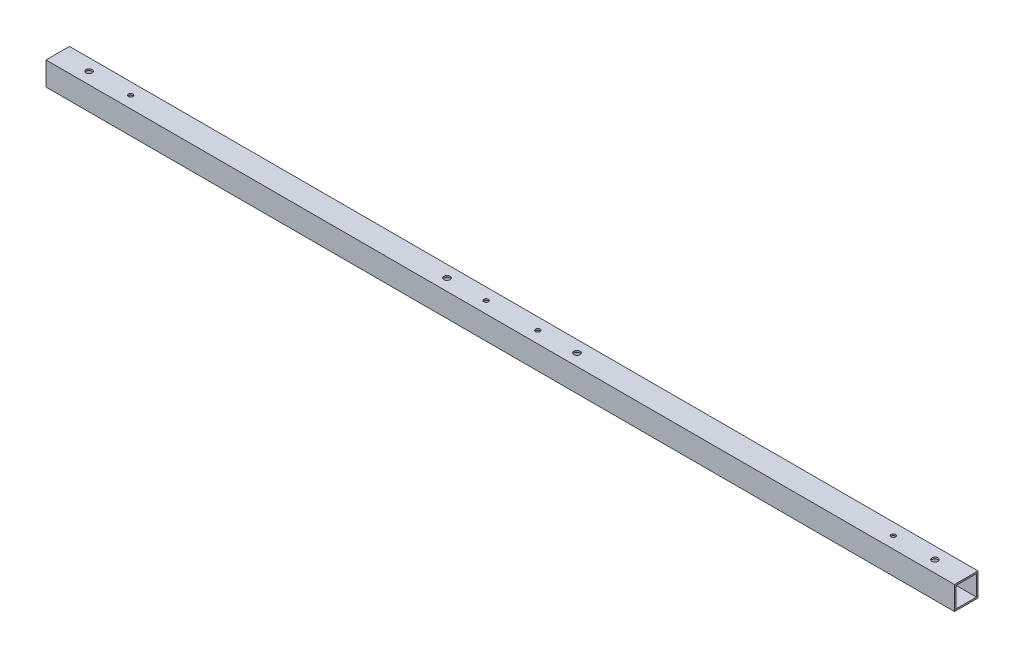
ISO-10303-21;
HEADER;
FILE_DESCRIPTION(('STEP AP214'),'2;1');
FILE_NAME('part.step','',(''),(''),'','','');
FILE_SCHEMA(('AUTOMOTIVE_DESIGN { 1 0 10303 214 1 1 1 1 }'));
ENDSEC;
DATA;
#1=APPLICATION_CONTEXT('core data for automotive mechanical design processes');
#2=APPLICATION_PROTOCOL_DEFINITION('international standard','automotive_design',2000,#1);
#3=PRODUCT_CONTEXT('',#1,'mechanical');
#4=PRODUCT('Part','Part','',(#3));
#5=PRODUCT_RELATED_PRODUCT_CATEGORY('part','',(#4));
#6=PRODUCT_DEFINITION_FORMATION('','',#4);
#7=PRODUCT_DEFINITION_CONTEXT('part definition',#1,'design');
#8=PRODUCT_DEFINITION('design','',#6,#7);
#9=PRODUCT_DEFINITION_SHAPE('','',#8);
#10=(LENGTH_UNIT() NAMED_UNIT(*) SI_UNIT(.MILLI.,.METRE.));
#11=(NAMED_UNIT(*) PLANE_ANGLE_UNIT() SI_UNIT($,.RADIAN.));
#12=(NAMED_UNIT(*) SI_UNIT($,.STERADIAN.) SOLID_ANGLE_UNIT());
#13=UNCERTAINTY_MEASURE_WITH_UNIT(LENGTH_MEASURE(1.E-05),#10,'distance_accuracy_value','');
#14=(GEOMETRIC_REPRESENTATION_CONTEXT(3) GLOBAL_UNCERTAINTY_ASSIGNED_CONTEXT((#13)) GLOBAL_UNIT_ASSIGNED_CONTEXT((#10,
#11,#12)) REPRESENTATION_CONTEXT('',''));
#15=CARTESIAN_POINT('',(0.,0.,0.));
#16=DIRECTION('',(0.,0.,1.));
#17=DIRECTION('',(1.,0.,0.));
#18=AXIS2_PLACEMENT_3D('',#15,#16,#17);
#19=CARTESIAN_POINT('',(320.,-6.50000000000001,-6.49999999999999));
#20=DIRECTION('',(0.,0.,1.));
#21=DIRECTION('',(1.,0.,0.));
#22=AXIS2_PLACEMENT_3D('',#19,#20,#21);
#23=PLANE('',#22);
#24=DIRECTION('',(0.,1.,0.));
#25=VECTOR('',#24,1.);
#26=CARTESIAN_POINT('',(-290.,-6.50000000000001,-6.49999999999999));
#27=LINE('',#26,#25);
#28=CARTESIAN_POINT('',(-290.,-6.50000000000001,-6.49999999999999));
#29=VERTEX_POINT('',#28);
#30=CARTESIAN_POINT('',(-290.,6.49999999999999,-6.49999999999999));
#31=VERTEX_POINT('',#30);
#32=EDGE_CURVE('E134',#29,#31,#27,.T.);
#33=ORIENTED_EDGE('',*,*,#32,.F.);
#34=DIRECTION('',(-1.,0.,0.));
#35=VECTOR('',#34,1.);
#36=CARTESIAN_POINT('',(320.,-6.50000000000001,-6.49999999999999));
#37=LINE('',#36,#35);
#38=CARTESIAN_POINT('',(290.,-6.50000000000001,-6.49999999999999));
#39=VERTEX_POINT('',#38);
#40=EDGE_CURVE('E202',#39,#29,#37,.T.);
#41=ORIENTED_EDGE('',*,*,#40,.F.);
#42=DIRECTION('',(0.,-1.,0.));
#43=VECTOR('',#42,1.);
#44=CARTESIAN_POINT('',(290.,-6.50000000000001,-6.49999999999999));
#45=LINE('',#44,#43);
#46=CARTESIAN_POINT('',(290.,6.49999999999999,-6.49999999999999));
#47=VERTEX_POINT('',#46);
#48=EDGE_CURVE('E376',#47,#39,#45,.T.);
#49=ORIENTED_EDGE('',*,*,#48,.F.);
#50=DIRECTION('',(-1.,0.,0.));
#51=VECTOR('',#50,1.);
#52=CARTESIAN_POINT('',(320.,6.49999999999999,-6.49999999999999));
#53=LINE('',#52,#51);
#54=EDGE_CURVE('E153',#47,#31,#53,.T.);
#55=ORIENTED_EDGE('',*,*,#54,.T.);
#56=EDGE_LOOP('',(#33,#41,#49,#55));
#57=FACE_BOUND('',#56,.T.);
#58=ADVANCED_FACE('F61',(#57),#23,.T.);
#59=CARTESIAN_POINT('',(320.,-6.50000000000001,6.50000000000001));
#60=DIRECTION('',(0.,1.,0.));
#61=DIRECTION('',(0.,0.,1.));
#62=AXIS2_PLACEMENT_3D('',#59,#60,#61);
#63=PLANE('',#62);
#64=DIRECTION('',(0.,0.,-1.));
#65=VECTOR('',#64,1.);
#66=CARTESIAN_POINT('',(-290.,-6.50000000000001,6.50000000000001));
#67=LINE('',#66,#65);
#68=CARTESIAN_POINT('',(-290.,-6.50000000000001,6.50000000000001));
#69=VERTEX_POINT('',#68);
#70=EDGE_CURVE('E251',#69,#29,#67,.T.);
#71=ORIENTED_EDGE('',*,*,#70,.F.);
#72=DIRECTION('',(-1.,0.,0.));
#73=VECTOR('',#72,1.);
#74=CARTESIAN_POINT('',(320.,-6.50000000000001,6.50000000000001));
#75=LINE('',#74,#73);
#76=CARTESIAN_POINT('',(290.,-6.50000000000001,6.50000000000001));
#77=VERTEX_POINT('',#76);
#78=EDGE_CURVE('E208',#77,#69,#75,.T.);
#79=ORIENTED_EDGE('',*,*,#78,.F.);
#80=DIRECTION('',(0.,0.,1.));
#81=VECTOR('',#80,1.);
#82=CARTESIAN_POINT('',(290.,-6.50000000000001,6.50000000000001));
#83=LINE('',#82,#81);
#84=EDGE_CURVE('E373',#39,#77,#83,.T.);
#85=ORIENTED_EDGE('',*,*,#84,.F.);
#86=ORIENTED_EDGE('',*,*,#40,.T.);
#87=EDGE_LOOP('',(#71,#79,#85,#86));
#88=FACE_BOUND('',#87,.T.);
#89=CARTESIAN_POINT('',(-16.5,-6.50000000000001,0.));
#90=DIRECTION('',(0.,1.,0.));
#91=DIRECTION('',(0.,0.,1.));
#92=AXIS2_PLACEMENT_3D('',#89,#90,#91);
#93=CIRCLE('',#92,1.45);
#94=CARTESIAN_POINT('',(-16.5,-6.50000000000001,1.45));
#95=VERTEX_POINT('',#94);
#96=EDGE_CURVE('E200',#95,#95,#93,.T.);
#97=ORIENTED_EDGE('',*,*,#96,.F.);
#98=EDGE_LOOP('',(#97));
#99=FACE_BOUND('',#98,.T.);
#100=CARTESIAN_POINT('',(16.5,-6.50000000000001,0.));
#101=DIRECTION('',(0.,1.,0.));
#102=DIRECTION('',(0.,0.,1.));
#103=AXIS2_PLACEMENT_3D('',#100,#101,#102);
#104=CIRCLE('',#103,1.45);
#105=CARTESIAN_POINT('',(16.5,-6.50000000000001,1.45));
#106=VERTEX_POINT('',#105);
#107=EDGE_CURVE('E195',#106,#106,#104,.T.);
#108=ORIENTED_EDGE('',*,*,#107,.F.);
#109=EDGE_LOOP('',(#108));
#110=FACE_BOUND('',#109,.T.);
#111=CARTESIAN_POINT('',(-243.5,-6.50000000000001,0.));
#112=DIRECTION('',(0.,1.,0.));
#113=DIRECTION('',(0.,0.,1.));
#114=AXIS2_PLACEMENT_3D('',#111,#112,#113);
#115=CIRCLE('',#114,1.45);
#116=CARTESIAN_POINT('',(-243.5,-6.50000000000001,1.45));
#117=VERTEX_POINT('',#116);
#118=EDGE_CURVE('E190',#117,#117,#115,.T.);
#119=ORIENTED_EDGE('',*,*,#118,.F.);
#120=EDGE_LOOP('',(#119));
#121=FACE_BOUND('',#120,.T.);
#122=CARTESIAN_POINT('',(243.5,-6.50000000000001,0.));
#123=DIRECTION('',(0.,1.,0.));
#124=DIRECTION('',(0.,0.,1.));
#125=AXIS2_PLACEMENT_3D('',#122,#123,#124);
#126=CIRCLE('',#125,1.45);
#127=CARTESIAN_POINT('',(243.5,-6.50000000000001,1.44999999999994));
#128=VERTEX_POINT('',#127);
#129=EDGE_CURVE('E184',#128,#128,#126,.T.);
#130=ORIENTED_EDGE('',*,*,#129,.F.);
#131=EDGE_LOOP('',(#130));
#132=FACE_BOUND('',#131,.T.);
#133=CARTESIAN_POINT('',(-270.,-6.50000000000001,0.));
#134=DIRECTION('',(0.,1.,0.));
#135=DIRECTION('',(0.,0.,1.));
#136=AXIS2_PLACEMENT_3D('',#133,#134,#135);
#137=CIRCLE('',#136,1.95000000000003);
#138=CARTESIAN_POINT('',(-270.,-6.50000000000001,1.95000000000003));
#139=VERTEX_POINT('',#138);
#140=EDGE_CURVE('E179',#139,#139,#137,.T.);
#141=ORIENTED_EDGE('',*,*,#140,.F.);
#142=EDGE_LOOP('',(#141));
#143=FACE_BOUND('',#142,.T.);
#144=CARTESIAN_POINT('',(270.,-6.50000000000001,0.));
#145=DIRECTION('',(0.,1.,0.));
#146=DIRECTION('',(0.,0.,1.));
#147=AXIS2_PLACEMENT_3D('',#144,#145,#146);
#148=CIRCLE('',#147,1.95000000000003);
#149=CARTESIAN_POINT('',(270.,-6.50000000000001,1.94999999999996));
#150=VERTEX_POINT('',#149);
#151=EDGE_CURVE('E174',#150,#150,#148,.T.);
#152=ORIENTED_EDGE('',*,*,#151,.F.);
#153=EDGE_LOOP('',(#152));
#154=FACE_BOUND('',#153,.T.);
#155=CARTESIAN_POINT('',(41.5,-6.50000000000001,0.));
#156=DIRECTION('',(0.,1.,0.));
#157=DIRECTION('',(0.,0.,1.));
#158=AXIS2_PLACEMENT_3D('',#155,#156,#157);
#159=CIRCLE('',#158,1.95);
#160=CARTESIAN_POINT('',(41.5,-6.50000000000001,1.94999999999999));
#161=VERTEX_POINT('',#160);
#162=EDGE_CURVE('E169',#161,#161,#159,.T.);
#163=ORIENTED_EDGE('',*,*,#162,.F.);
#164=EDGE_LOOP('',(#163));
#165=FACE_BOUND('',#164,.T.);
#166=CARTESIAN_POINT('',(-41.5,-6.50000000000001,0.));
#167=DIRECTION('',(0.,1.,0.));
#168=DIRECTION('',(0.,0.,1.));
#169=AXIS2_PLACEMENT_3D('',#166,#167,#168);
#170=CIRCLE('',#169,1.95);
#171=CARTESIAN_POINT('',(-41.5,-6.50000000000001,1.95));
#172=VERTEX_POINT('',#171);
#173=EDGE_CURVE('E163',#172,#172,#170,.T.);
#174=ORIENTED_EDGE('',*,*,#173,.F.);
#175=EDGE_LOOP('',(#174));
#176=FACE_BOUND('',#175,.T.);
#177=ADVANCED_FACE('F346',(#88,#99,#110,#121,#132,#143,#154,#165,#176),#63,.T.);
#178=CARTESIAN_POINT('',(320.,-6.50000000000001,6.50000000000001));
#179=DIRECTION('',(0.,0.,-1.));
#180=DIRECTION('',(-1.,0.,0.));
#181=AXIS2_PLACEMENT_3D('',#178,#179,#180);
#182=PLANE('',#181);
#183=DIRECTION('',(0.,-1.,0.));
#184=VECTOR('',#183,1.);
#185=CARTESIAN_POINT('',(-290.,-6.50000000000001,6.50000000000001));
#186=LINE('',#185,#184);
#187=CARTESIAN_POINT('',(-290.,6.49999999999999,6.50000000000001));
#188=VERTEX_POINT('',#187);
#189=EDGE_CURVE('E248',#188,#69,#186,.T.);
#190=ORIENTED_EDGE('',*,*,#189,.F.);
#191=DIRECTION('',(-1.,0.,0.));
#192=VECTOR('',#191,1.);
#193=CARTESIAN_POINT('',(320.,6.49999999999999,6.50000000000001));
#194=LINE('',#193,#192);
#195=CARTESIAN_POINT('',(290.,6.49999999999999,6.50000000000001));
#196=VERTEX_POINT('',#195);
#197=EDGE_CURVE('E216',#196,#188,#194,.T.);
#198=ORIENTED_EDGE('',*,*,#197,.F.);
#199=DIRECTION('',(0.,1.,0.));
#200=VECTOR('',#199,1.);
#201=CARTESIAN_POINT('',(290.,-6.50000000000001,6.50000000000001));
#202=LINE('',#201,#200);
#203=EDGE_CURVE('E246',#77,#196,#202,.T.);
#204=ORIENTED_EDGE('',*,*,#203,.F.);
#205=ORIENTED_EDGE('',*,*,#78,.T.);
#206=EDGE_LOOP('',(#190,#198,#204,#205));
#207=FACE_BOUND('',#206,.T.);
#208=ADVANCED_FACE('F245',(#207),#182,.T.);
#209=CARTESIAN_POINT('',(320.,-7.50000000000001,-7.49999999999999));
#210=DIRECTION('',(0.,0.,1.));
#211=DIRECTION('',(1.,0.,0.));
#212=AXIS2_PLACEMENT_3D('',#209,#210,#211);
#213=PLANE('',#212);
#214=DIRECTION('',(-1.,0.,0.));
#215=VECTOR('',#214,1.);
#216=CARTESIAN_POINT('',(320.,-7.50000000000001,-7.49999999999999));
#217=LINE('',#216,#215);
#218=CARTESIAN_POINT('',(290.,-7.50000000000001,-7.49999999999999));
#219=VERTEX_POINT('',#218);
#220=CARTESIAN_POINT('',(-290.,-7.50000000000001,-7.49999999999999));
#221=VERTEX_POINT('',#220);
#222=EDGE_CURVE('E155',#219,#221,#217,.T.);
#223=ORIENTED_EDGE('',*,*,#222,.T.);
#224=DIRECTION('',(0.,1.,0.));
#225=VECTOR('',#224,1.);
#226=CARTESIAN_POINT('',(-290.,-7.50000000000001,-7.49999999999999));
#227=LINE('',#226,#225);
#228=CARTESIAN_POINT('',(-290.,7.49999999999999,-7.49999999999999));
#229=VERTEX_POINT('',#228);
#230=EDGE_CURVE('E85',#221,#229,#227,.T.);
#231=ORIENTED_EDGE('',*,*,#230,.T.);
#232=DIRECTION('',(-1.,0.,0.));
#233=VECTOR('',#232,1.);
#234=CARTESIAN_POINT('',(320.,7.49999999999999,-7.49999999999999));
#235=LINE('',#234,#233);
#236=CARTESIAN_POINT('',(290.,7.49999999999999,-7.49999999999999));
#237=VERTEX_POINT('',#236);
#238=EDGE_CURVE('E143',#237,#229,#235,.T.);
#239=ORIENTED_EDGE('',*,*,#238,.F.);
#240=DIRECTION('',(0.,-1.,0.));
#241=VECTOR('',#240,1.);
#242=CARTESIAN_POINT('',(290.,-7.50000000000001,-7.49999999999999));
#243=LINE('',#242,#241);
#244=EDGE_CURVE('E252',#237,#219,#243,.T.);
#245=ORIENTED_EDGE('',*,*,#244,.T.);
#246=EDGE_LOOP('',(#223,#231,#239,#245));
#247=FACE_BOUND('',#246,.T.);
#248=ADVANCED_FACE('F63',(#247),#213,.F.);
#249=CARTESIAN_POINT('',(320.,7.49999999999999,7.50000000000001));
#250=DIRECTION('',(0.,-1.,0.));
#251=DIRECTION('',(0.,0.,-1.));
#252=AXIS2_PLACEMENT_3D('',#249,#250,#251);
#253=PLANE('',#252);
#254=CARTESIAN_POINT('',(-16.5,7.49999999999999,0.));
#255=DIRECTION('',(0.,1.,0.));
#256=DIRECTION('',(0.,0.,1.));
#257=AXIS2_PLACEMENT_3D('',#254,#255,#256);
#258=CIRCLE('',#257,1.45);
#259=CARTESIAN_POINT('',(-16.5,7.49999999999999,1.45));
#260=VERTEX_POINT('',#259);
#261=EDGE_CURVE('E268',#260,#260,#258,.T.);
#262=ORIENTED_EDGE('',*,*,#261,.F.);
#263=EDGE_LOOP('',(#262));
#264=FACE_BOUND('',#263,.T.);
#265=CARTESIAN_POINT('',(16.5,7.49999999999999,0.));
#266=DIRECTION('',(0.,1.,0.));
#267=DIRECTION('',(0.,0.,1.));
#268=AXIS2_PLACEMENT_3D('',#265,#266,#267);
#269=CIRCLE('',#268,1.45);
#270=CARTESIAN_POINT('',(16.5,7.49999999999999,1.45));
#271=VERTEX_POINT('',#270);
#272=EDGE_CURVE('E272',#271,#271,#269,.T.);
#273=ORIENTED_EDGE('',*,*,#272,.F.);
#274=EDGE_LOOP('',(#273));
#275=FACE_BOUND('',#274,.T.);
#276=CARTESIAN_POINT('',(-243.5,7.49999999999999,0.));
#277=DIRECTION('',(0.,1.,0.));
#278=DIRECTION('',(0.,0.,1.));
#279=AXIS2_PLACEMENT_3D('',#276,#277,#278);
#280=CIRCLE('',#279,1.45);
#281=CARTESIAN_POINT('',(-243.5,7.49999999999999,1.45));
#282=VERTEX_POINT('',#281);
#283=EDGE_CURVE('E289',#282,#282,#280,.T.);
#284=ORIENTED_EDGE('',*,*,#283,.F.);
#285=EDGE_LOOP('',(#284));
#286=FACE_BOUND('',#285,.T.);
#287=CARTESIAN_POINT('',(243.5,7.49999999999999,0.));
#288=DIRECTION('',(0.,1.,0.));
#289=DIRECTION('',(0.,0.,-1.));
#290=AXIS2_PLACEMENT_3D('',#287,#288,#289);
#291=CIRCLE('',#290,1.45);
#292=CARTESIAN_POINT('',(243.5,7.49999999999999,-1.45000000000006));
#293=VERTEX_POINT('',#292);
#294=EDGE_CURVE('E293',#293,#293,#291,.T.);
#295=ORIENTED_EDGE('',*,*,#294,.F.);
#296=EDGE_LOOP('',(#295));
#297=FACE_BOUND('',#296,.T.);
#298=CARTESIAN_POINT('',(-270.,7.49999999999999,0.));
#299=DIRECTION('',(0.,1.,0.));
#300=DIRECTION('',(0.,0.,1.));
#301=AXIS2_PLACEMENT_3D('',#298,#299,#300);
#302=CIRCLE('',#301,1.95000000000003);
#303=CARTESIAN_POINT('',(-270.,7.49999999999999,1.95000000000003));
#304=VERTEX_POINT('',#303);
#305=EDGE_CURVE('E315',#304,#304,#302,.T.);
#306=ORIENTED_EDGE('',*,*,#305,.F.);
#307=EDGE_LOOP('',(#306));
#308=FACE_BOUND('',#307,.T.);
#309=CARTESIAN_POINT('',(270.,7.49999999999999,0.));
#310=DIRECTION('',(0.,1.,0.));
#311=DIRECTION('',(0.,0.,-1.));
#312=AXIS2_PLACEMENT_3D('',#309,#310,#311);
#313=CIRCLE('',#312,1.95000000000003);
#314=CARTESIAN_POINT('',(270.,7.49999999999999,-1.95000000000009));
#315=VERTEX_POINT('',#314);
#316=EDGE_CURVE('E324',#315,#315,#313,.T.);
#317=ORIENTED_EDGE('',*,*,#316,.F.);
#318=EDGE_LOOP('',(#317));
#319=FACE_BOUND('',#318,.T.);
#320=CARTESIAN_POINT('',(41.5,7.49999999999999,0.));
#321=DIRECTION('',(0.,1.,0.));
#322=DIRECTION('',(0.,0.,-1.));
#323=AXIS2_PLACEMENT_3D('',#320,#321,#322);
#324=CIRCLE('',#323,1.95);
#325=CARTESIAN_POINT('',(41.5,7.49999999999999,-1.95000000000001));
#326=VERTEX_POINT('',#325);
#327=EDGE_CURVE('E307',#326,#326,#324,.T.);
#328=ORIENTED_EDGE('',*,*,#327,.F.);
#329=EDGE_LOOP('',(#328));
#330=FACE_BOUND('',#329,.T.);
#331=CARTESIAN_POINT('',(-41.5,7.49999999999999,0.));
#332=DIRECTION('',(0.,1.,0.));
#333=DIRECTION('',(0.,0.,1.));
#334=AXIS2_PLACEMENT_3D('',#331,#332,#333);
#335=CIRCLE('',#334,1.95);
#336=CARTESIAN_POINT('',(-41.5,7.49999999999999,1.95));
#337=VERTEX_POINT('',#336);
#338=EDGE_CURVE('E319',#337,#337,#335,.T.);
#339=ORIENTED_EDGE('',*,*,#338,.F.);
#340=EDGE_LOOP('',(#339));
#341=FACE_BOUND('',#340,.T.);
#342=ORIENTED_EDGE('',*,*,#238,.T.);
#343=DIRECTION('',(0.,0.,-1.));
#344=VECTOR('',#343,1.);
#345=CARTESIAN_POINT('',(-290.,7.49999999999999,-45.5734664373094));
#346=LINE('',#345,#344);
#347=CARTESIAN_POINT('',(-290.,7.49999999999999,7.50000000000001));
#348=VERTEX_POINT('',#347);
#349=EDGE_CURVE('E127',#348,#229,#346,.T.);
#350=ORIENTED_EDGE('',*,*,#349,.F.);
#351=DIRECTION('',(-1.,0.,0.));
#352=VECTOR('',#351,1.);
#353=CARTESIAN_POINT('',(320.,7.49999999999999,7.50000000000001));
#354=LINE('',#353,#352);
#355=CARTESIAN_POINT('',(290.,7.49999999999999,7.50000000000001));
#356=VERTEX_POINT('',#355);
#357=EDGE_CURVE('E141',#356,#348,#354,.T.);
#358=ORIENTED_EDGE('',*,*,#357,.F.);
#359=DIRECTION('',(0.,0.,1.));
#360=VECTOR('',#359,1.);
#361=CARTESIAN_POINT('',(290.,7.49999999999999,-37.5928594114211));
#362=LINE('',#361,#360);
#363=EDGE_CURVE('E145',#237,#356,#362,.T.);
#364=ORIENTED_EDGE('',*,*,#363,.F.);
#365=EDGE_LOOP('',(#342,#350,#358,#364));
#366=FACE_BOUND('',#365,.T.);
#367=ADVANCED_FACE('F139',(#264,#275,#286,#297,#308,#319,#330,#341,#366),#253,.F.);
#368=CARTESIAN_POINT('',(320.,-7.50000000000001,7.49999999999999));
#369=DIRECTION('',(0.,0.,-1.));
#370=DIRECTION('',(0.,1.,0.));
#371=AXIS2_PLACEMENT_3D('',#368,#369,#370);
#372=PLANE('',#371);
#373=ORIENTED_EDGE('',*,*,#357,.T.);
#374=DIRECTION('',(0.,-1.,0.));
#375=VECTOR('',#374,1.);
#376=CARTESIAN_POINT('',(-290.,-7.50000000000001,7.49999999999999));
#377=LINE('',#376,#375);
#378=CARTESIAN_POINT('',(-290.,-7.50000000000001,7.49999999999999));
#379=VERTEX_POINT('',#378);
#380=EDGE_CURVE('E124',#348,#379,#377,.T.);
#381=ORIENTED_EDGE('',*,*,#380,.T.);
#382=DIRECTION('',(-1.,0.,0.));
#383=VECTOR('',#382,1.);
#384=CARTESIAN_POINT('',(320.,-7.50000000000001,7.49999999999999));
#385=LINE('',#384,#383);
#386=CARTESIAN_POINT('',(290.,-7.50000000000001,7.49999999999999));
#387=VERTEX_POINT('',#386);
#388=EDGE_CURVE('E149',#387,#379,#385,.T.);
#389=ORIENTED_EDGE('',*,*,#388,.F.);
#390=DIRECTION('',(0.,1.,0.));
#391=VECTOR('',#390,1.);
#392=CARTESIAN_POINT('',(290.,-7.50000000000001,7.49999999999999));
#393=LINE('',#392,#391);
#394=EDGE_CURVE('E77',#387,#356,#393,.T.);
#395=ORIENTED_EDGE('',*,*,#394,.T.);
#396=EDGE_LOOP('',(#373,#381,#389,#395));
#397=FACE_BOUND('',#396,.T.);
#398=ADVANCED_FACE('F147',(#397),#372,.F.);
#399=CARTESIAN_POINT('',(320.,-7.50000000000001,7.49999999999999));
#400=DIRECTION('',(0.,1.,0.));
#401=DIRECTION('',(0.,0.,1.));
#402=AXIS2_PLACEMENT_3D('',#399,#400,#401);
#403=PLANE('',#402);
#404=CARTESIAN_POINT('',(-16.5,-7.50000000000001,0.));
#405=DIRECTION('',(0.,1.,0.));
#406=DIRECTION('',(0.,0.,1.));
#407=AXIS2_PLACEMENT_3D('',#404,#405,#406);
#408=CIRCLE('',#407,1.45);
#409=CARTESIAN_POINT('',(-16.5,-7.50000000000001,1.45));
#410=VERTEX_POINT('',#409);
#411=EDGE_CURVE('E196',#410,#410,#408,.T.);
#412=ORIENTED_EDGE('',*,*,#411,.T.);
#413=EDGE_LOOP('',(#412));
#414=FACE_BOUND('',#413,.T.);
#415=CARTESIAN_POINT('',(16.5,-7.50000000000001,0.));
#416=DIRECTION('',(0.,1.,0.));
#417=DIRECTION('',(0.,0.,1.));
#418=AXIS2_PLACEMENT_3D('',#415,#416,#417);
#419=CIRCLE('',#418,1.45);
#420=CARTESIAN_POINT('',(16.5,-7.50000000000001,1.45));
#421=VERTEX_POINT('',#420);
#422=EDGE_CURVE('E264',#421,#421,#419,.T.);
#423=ORIENTED_EDGE('',*,*,#422,.T.);
#424=EDGE_LOOP('',(#423));
#425=FACE_BOUND('',#424,.T.);
#426=CARTESIAN_POINT('',(-243.5,-7.50000000000001,0.));
#427=DIRECTION('',(0.,1.,0.));
#428=DIRECTION('',(0.,0.,1.));
#429=AXIS2_PLACEMENT_3D('',#426,#427,#428);
#430=CIRCLE('',#429,1.45);
#431=CARTESIAN_POINT('',(-243.5,-7.50000000000001,1.45));
#432=VERTEX_POINT('',#431);
#433=EDGE_CURVE('E185',#432,#432,#430,.T.);
#434=ORIENTED_EDGE('',*,*,#433,.T.);
#435=EDGE_LOOP('',(#434));
#436=FACE_BOUND('',#435,.T.);
#437=CARTESIAN_POINT('',(243.5,-7.50000000000001,0.));
#438=DIRECTION('',(0.,1.,0.));
#439=DIRECTION('',(0.,0.,-1.));
#440=AXIS2_PLACEMENT_3D('',#437,#438,#439);
#441=CIRCLE('',#440,1.45);
#442=CARTESIAN_POINT('',(243.5,-7.50000000000001,-1.45000000000006));
#443=VERTEX_POINT('',#442);
#444=EDGE_CURVE('E285',#443,#443,#441,.T.);
#445=ORIENTED_EDGE('',*,*,#444,.T.);
#446=EDGE_LOOP('',(#445));
#447=FACE_BOUND('',#446,.T.);
#448=CARTESIAN_POINT('',(-270.,-7.50000000000001,0.));
#449=DIRECTION('',(0.,1.,0.));
#450=DIRECTION('',(0.,0.,1.));
#451=AXIS2_PLACEMENT_3D('',#448,#449,#450);
#452=CIRCLE('',#451,1.95000000000003);
#453=CARTESIAN_POINT('',(-270.,-7.50000000000001,1.95000000000003));
#454=VERTEX_POINT('',#453);
#455=EDGE_CURVE('E320',#454,#454,#452,.T.);
#456=ORIENTED_EDGE('',*,*,#455,.T.);
#457=EDGE_LOOP('',(#456));
#458=FACE_BOUND('',#457,.T.);
#459=CARTESIAN_POINT('',(270.,-7.50000000000001,0.));
#460=DIRECTION('',(0.,1.,0.));
#461=DIRECTION('',(0.,0.,-1.));
#462=AXIS2_PLACEMENT_3D('',#459,#460,#461);
#463=CIRCLE('',#462,1.95000000000003);
#464=CARTESIAN_POINT('',(270.,-7.50000000000001,-1.95000000000009));
#465=VERTEX_POINT('',#464);
#466=EDGE_CURVE('E311',#465,#465,#463,.T.);
#467=ORIENTED_EDGE('',*,*,#466,.T.);
#468=EDGE_LOOP('',(#467));
#469=FACE_BOUND('',#468,.T.);
#470=CARTESIAN_POINT('',(41.5,-7.50000000000001,0.));
#471=DIRECTION('',(0.,1.,0.));
#472=DIRECTION('',(0.,0.,-1.));
#473=AXIS2_PLACEMENT_3D('',#470,#471,#472);
#474=CIRCLE('',#473,1.95);
#475=CARTESIAN_POINT('',(41.5,-7.50000000000001,-1.95000000000001));
#476=VERTEX_POINT('',#475);
#477=EDGE_CURVE('E306',#476,#476,#474,.T.);
#478=ORIENTED_EDGE('',*,*,#477,.T.);
#479=EDGE_LOOP('',(#478));
#480=FACE_BOUND('',#479,.T.);
#481=CARTESIAN_POINT('',(-41.5,-7.50000000000001,0.));
#482=DIRECTION('',(0.,1.,0.));
#483=DIRECTION('',(0.,0.,1.));
#484=AXIS2_PLACEMENT_3D('',#481,#482,#483);
#485=CIRCLE('',#484,1.95);
#486=CARTESIAN_POINT('',(-41.5,-7.50000000000001,1.95));
#487=VERTEX_POINT('',#486);
#488=EDGE_CURVE('E164',#487,#487,#485,.T.);
#489=ORIENTED_EDGE('',*,*,#488,.T.);
#490=EDGE_LOOP('',(#489));
#491=FACE_BOUND('',#490,.T.);
#492=ORIENTED_EDGE('',*,*,#388,.T.);
#493=DIRECTION('',(0.,0.,-1.));
#494=VECTOR('',#493,1.);
#495=CARTESIAN_POINT('',(-290.,-7.50000000000001,-45.5734664373094));
#496=LINE('',#495,#494);
#497=EDGE_CURVE('E128',#379,#221,#496,.T.);
#498=ORIENTED_EDGE('',*,*,#497,.T.);
#499=ORIENTED_EDGE('',*,*,#222,.F.);
#500=DIRECTION('',(0.,0.,1.));
#501=VECTOR('',#500,1.);
#502=CARTESIAN_POINT('',(290.,-7.50000000000001,-37.5928594114211));
#503=LINE('',#502,#501);
#504=EDGE_CURVE('E365',#219,#387,#503,.T.);
#505=ORIENTED_EDGE('',*,*,#504,.T.);
#506=EDGE_LOOP('',(#492,#498,#499,#505));
#507=FACE_BOUND('',#506,.T.);
#508=ADVANCED_FACE('F360',(#414,#425,#436,#447,#458,#469,#480,#491,#507),#403,.F.);
#509=CARTESIAN_POINT('',(320.,6.49999999999999,6.50000000000001));
#510=DIRECTION('',(0.,-1.,0.));
#511=DIRECTION('',(0.,0.,-1.));
#512=AXIS2_PLACEMENT_3D('',#509,#510,#511);
#513=PLANE('',#512);
#514=DIRECTION('',(0.,0.,1.));
#515=VECTOR('',#514,1.);
#516=CARTESIAN_POINT('',(-290.,6.49999999999999,6.50000000000001));
#517=LINE('',#516,#515);
#518=EDGE_CURVE('E12',#31,#188,#517,.T.);
#519=ORIENTED_EDGE('',*,*,#518,.F.);
#520=ORIENTED_EDGE('',*,*,#54,.F.);
#521=DIRECTION('',(0.,0.,-1.));
#522=VECTOR('',#521,1.);
#523=CARTESIAN_POINT('',(290.,6.49999999999999,6.50000000000001));
#524=LINE('',#523,#522);
#525=EDGE_CURVE('E70',#196,#47,#524,.T.);
#526=ORIENTED_EDGE('',*,*,#525,.F.);
#527=ORIENTED_EDGE('',*,*,#197,.T.);
#528=EDGE_LOOP('',(#519,#520,#526,#527));
#529=FACE_BOUND('',#528,.T.);
#530=CARTESIAN_POINT('',(-16.5,6.49999999999999,0.));
#531=DIRECTION('',(0.,-1.,0.));
#532=DIRECTION('',(0.,0.,-1.));
#533=AXIS2_PLACEMENT_3D('',#530,#531,#532);
#534=CIRCLE('',#533,1.45);
#535=CARTESIAN_POINT('',(-16.5,6.49999999999999,-1.45));
#536=VERTEX_POINT('',#535);
#537=EDGE_CURVE('E197',#536,#536,#534,.T.);
#538=ORIENTED_EDGE('',*,*,#537,.F.);
#539=EDGE_LOOP('',(#538));
#540=FACE_BOUND('',#539,.T.);
#541=CARTESIAN_POINT('',(16.5,6.49999999999999,0.));
#542=DIRECTION('',(0.,-1.,0.));
#543=DIRECTION('',(0.,0.,-1.));
#544=AXIS2_PLACEMENT_3D('',#541,#542,#543);
#545=CIRCLE('',#544,1.45);
#546=CARTESIAN_POINT('',(16.5,6.49999999999999,-1.45));
#547=VERTEX_POINT('',#546);
#548=EDGE_CURVE('E191',#547,#547,#545,.T.);
#549=ORIENTED_EDGE('',*,*,#548,.F.);
#550=EDGE_LOOP('',(#549));
#551=FACE_BOUND('',#550,.T.);
#552=CARTESIAN_POINT('',(-243.5,6.49999999999999,0.));
#553=DIRECTION('',(0.,-1.,0.));
#554=DIRECTION('',(0.,0.,-1.));
#555=AXIS2_PLACEMENT_3D('',#552,#553,#554);
#556=CIRCLE('',#555,1.45);
#557=CARTESIAN_POINT('',(-243.5,6.49999999999999,-1.45));
#558=VERTEX_POINT('',#557);
#559=EDGE_CURVE('E186',#558,#558,#556,.T.);
#560=ORIENTED_EDGE('',*,*,#559,.F.);
#561=EDGE_LOOP('',(#560));
#562=FACE_BOUND('',#561,.T.);
#563=CARTESIAN_POINT('',(243.5,6.49999999999999,0.));
#564=DIRECTION('',(0.,-1.,0.));
#565=DIRECTION('',(0.,0.,-1.));
#566=AXIS2_PLACEMENT_3D('',#563,#564,#565);
#567=CIRCLE('',#566,1.45);
#568=CARTESIAN_POINT('',(243.5,6.49999999999999,-1.45000000000006));
#569=VERTEX_POINT('',#568);
#570=EDGE_CURVE('E180',#569,#569,#567,.T.);
#571=ORIENTED_EDGE('',*,*,#570,.F.);
#572=EDGE_LOOP('',(#571));
#573=FACE_BOUND('',#572,.T.);
#574=CARTESIAN_POINT('',(-270.,6.49999999999999,0.));
#575=DIRECTION('',(0.,-1.,0.));
#576=DIRECTION('',(0.,0.,-1.));
#577=AXIS2_PLACEMENT_3D('',#574,#575,#576);
#578=CIRCLE('',#577,1.95000000000003);
#579=CARTESIAN_POINT('',(-270.,6.49999999999999,-1.95000000000003));
#580=VERTEX_POINT('',#579);
#581=EDGE_CURVE('E175',#580,#580,#578,.T.);
#582=ORIENTED_EDGE('',*,*,#581,.F.);
#583=EDGE_LOOP('',(#582));
#584=FACE_BOUND('',#583,.T.);
#585=CARTESIAN_POINT('',(270.,6.49999999999999,0.));
#586=DIRECTION('',(0.,-1.,0.));
#587=DIRECTION('',(0.,0.,-1.));
#588=AXIS2_PLACEMENT_3D('',#585,#586,#587);
#589=CIRCLE('',#588,1.95000000000003);
#590=CARTESIAN_POINT('',(270.,6.49999999999999,-1.95000000000009));
#591=VERTEX_POINT('',#590);
#592=EDGE_CURVE('E170',#591,#591,#589,.T.);
#593=ORIENTED_EDGE('',*,*,#592,.F.);
#594=EDGE_LOOP('',(#593));
#595=FACE_BOUND('',#594,.T.);
#596=CARTESIAN_POINT('',(41.5,6.49999999999999,0.));
#597=DIRECTION('',(0.,-1.,0.));
#598=DIRECTION('',(0.,0.,-1.));
#599=AXIS2_PLACEMENT_3D('',#596,#597,#598);
#600=CIRCLE('',#599,1.95);
#601=CARTESIAN_POINT('',(41.5,6.49999999999999,-1.95000000000001));
#602=VERTEX_POINT('',#601);
#603=EDGE_CURVE('E165',#602,#602,#600,.T.);
#604=ORIENTED_EDGE('',*,*,#603,.F.);
#605=EDGE_LOOP('',(#604));
#606=FACE_BOUND('',#605,.T.);
#607=CARTESIAN_POINT('',(-41.5,6.49999999999999,0.));
#608=DIRECTION('',(0.,-1.,0.));
#609=DIRECTION('',(0.,0.,-1.));
#610=AXIS2_PLACEMENT_3D('',#607,#608,#609);
#611=CIRCLE('',#610,1.95);
#612=CARTESIAN_POINT('',(-41.5,6.49999999999999,-1.95));
#613=VERTEX_POINT('',#612);
#614=EDGE_CURVE('E159',#613,#613,#611,.T.);
#615=ORIENTED_EDGE('',*,*,#614,.F.);
#616=EDGE_LOOP('',(#615));
#617=FACE_BOUND('',#616,.T.);
#618=ADVANCED_FACE('F239',(#529,#540,#551,#562,#573,#584,#595,#606,#617),#513,.T.);
#619=CARTESIAN_POINT('',(-41.5,-7.50000000000001,0.));
#620=DIRECTION('',(0.,1.,0.));
#621=DIRECTION('',(0.,0.,1.));
#622=AXIS2_PLACEMENT_3D('',#619,#620,#621);
#623=CYLINDRICAL_SURFACE('',#622,1.95);
#624=ORIENTED_EDGE('',*,*,#614,.T.);
#625=EDGE_LOOP('',(#624));
#626=FACE_BOUND('',#625,.T.);
#627=ORIENTED_EDGE('',*,*,#338,.T.);
#628=EDGE_LOOP('',(#627));
#629=FACE_BOUND('',#628,.T.);
#630=ADVANCED_FACE('F357',(#626,#629),#623,.F.);
#631=CARTESIAN_POINT('',(41.5,-7.50000000000001,0.));
#632=DIRECTION('',(0.,1.,0.));
#633=DIRECTION('',(0.,0.,1.));
#634=AXIS2_PLACEMENT_3D('',#631,#632,#633);
#635=CYLINDRICAL_SURFACE('',#634,1.95);
#636=ORIENTED_EDGE('',*,*,#603,.T.);
#637=EDGE_LOOP('',(#636));
#638=FACE_BOUND('',#637,.T.);
#639=ORIENTED_EDGE('',*,*,#327,.T.);
#640=EDGE_LOOP('',(#639));
#641=FACE_BOUND('',#640,.T.);
#642=ADVANCED_FACE('F422',(#638,#641),#635,.F.);
#643=CARTESIAN_POINT('',(270.,-7.50000000000001,0.));
#644=DIRECTION('',(0.,1.,0.));
#645=DIRECTION('',(0.,0.,1.));
#646=AXIS2_PLACEMENT_3D('',#643,#644,#645);
#647=CYLINDRICAL_SURFACE('',#646,1.95000000000003);
#648=ORIENTED_EDGE('',*,*,#592,.T.);
#649=EDGE_LOOP('',(#648));
#650=FACE_BOUND('',#649,.T.);
#651=ORIENTED_EDGE('',*,*,#316,.T.);
#652=EDGE_LOOP('',(#651));
#653=FACE_BOUND('',#652,.T.);
#654=ADVANCED_FACE('F427',(#650,#653),#647,.F.);
#655=CARTESIAN_POINT('',(-270.,-7.50000000000001,0.));
#656=DIRECTION('',(0.,1.,0.));
#657=DIRECTION('',(0.,0.,1.));
#658=AXIS2_PLACEMENT_3D('',#655,#656,#657);
#659=CYLINDRICAL_SURFACE('',#658,1.95000000000003);
#660=ORIENTED_EDGE('',*,*,#581,.T.);
#661=EDGE_LOOP('',(#660));
#662=FACE_BOUND('',#661,.T.);
#663=ORIENTED_EDGE('',*,*,#305,.T.);
#664=EDGE_LOOP('',(#663));
#665=FACE_BOUND('',#664,.T.);
#666=ADVANCED_FACE('F355',(#662,#665),#659,.F.);
#667=ORIENTED_EDGE('',*,*,#173,.T.);
#668=EDGE_LOOP('',(#667));
#669=FACE_BOUND('',#668,.T.);
#670=ORIENTED_EDGE('',*,*,#488,.F.);
#671=EDGE_LOOP('',(#670));
#672=FACE_BOUND('',#671,.T.);
#673=ADVANCED_FACE('F352',(#669,#672),#623,.F.);
#674=ORIENTED_EDGE('',*,*,#162,.T.);
#675=EDGE_LOOP('',(#674));
#676=FACE_BOUND('',#675,.T.);
#677=ORIENTED_EDGE('',*,*,#477,.F.);
#678=EDGE_LOOP('',(#677));
#679=FACE_BOUND('',#678,.T.);
#680=ADVANCED_FACE('F343',(#676,#679),#635,.F.);
#681=ORIENTED_EDGE('',*,*,#151,.T.);
#682=EDGE_LOOP('',(#681));
#683=FACE_BOUND('',#682,.T.);
#684=ORIENTED_EDGE('',*,*,#466,.F.);
#685=EDGE_LOOP('',(#684));
#686=FACE_BOUND('',#685,.T.);
#687=ADVANCED_FACE('F492',(#683,#686),#647,.F.);
#688=ORIENTED_EDGE('',*,*,#140,.T.);
#689=EDGE_LOOP('',(#688));
#690=FACE_BOUND('',#689,.T.);
#691=ORIENTED_EDGE('',*,*,#455,.F.);
#692=EDGE_LOOP('',(#691));
#693=FACE_BOUND('',#692,.T.);
#694=ADVANCED_FACE('F501',(#690,#693),#659,.F.);
#695=CARTESIAN_POINT('',(243.5,-7.50000000000001,0.));
#696=DIRECTION('',(0.,1.,0.));
#697=DIRECTION('',(0.,0.,1.));
#698=AXIS2_PLACEMENT_3D('',#695,#696,#697);
#699=CYLINDRICAL_SURFACE('',#698,1.45);
#700=ORIENTED_EDGE('',*,*,#570,.T.);
#701=EDGE_LOOP('',(#700));
#702=FACE_BOUND('',#701,.T.);
#703=ORIENTED_EDGE('',*,*,#294,.T.);
#704=EDGE_LOOP('',(#703));
#705=FACE_BOUND('',#704,.T.);
#706=ADVANCED_FACE('F530',(#702,#705),#699,.F.);
#707=CARTESIAN_POINT('',(-243.5,-7.50000000000001,0.));
#708=DIRECTION('',(0.,1.,0.));
#709=DIRECTION('',(0.,0.,1.));
#710=AXIS2_PLACEMENT_3D('',#707,#708,#709);
#711=CYLINDRICAL_SURFACE('',#710,1.45);
#712=ORIENTED_EDGE('',*,*,#559,.T.);
#713=EDGE_LOOP('',(#712));
#714=FACE_BOUND('',#713,.T.);
#715=ORIENTED_EDGE('',*,*,#283,.T.);
#716=EDGE_LOOP('',(#715));
#717=FACE_BOUND('',#716,.T.);
#718=ADVANCED_FACE('F538',(#714,#717),#711,.F.);
#719=ORIENTED_EDGE('',*,*,#129,.T.);
#720=EDGE_LOOP('',(#719));
#721=FACE_BOUND('',#720,.T.);
#722=ORIENTED_EDGE('',*,*,#444,.F.);
#723=EDGE_LOOP('',(#722));
#724=FACE_BOUND('',#723,.T.);
#725=ADVANCED_FACE('F541',(#721,#724),#699,.F.);
#726=ORIENTED_EDGE('',*,*,#118,.T.);
#727=EDGE_LOOP('',(#726));
#728=FACE_BOUND('',#727,.T.);
#729=ORIENTED_EDGE('',*,*,#433,.F.);
#730=EDGE_LOOP('',(#729));
#731=FACE_BOUND('',#730,.T.);
#732=ADVANCED_FACE('F551',(#728,#731),#711,.F.);
#733=CARTESIAN_POINT('',(16.5,-7.50000000000001,0.));
#734=DIRECTION('',(0.,1.,0.));
#735=DIRECTION('',(0.,0.,1.));
#736=AXIS2_PLACEMENT_3D('',#733,#734,#735);
#737=CYLINDRICAL_SURFACE('',#736,1.45);
#738=ORIENTED_EDGE('',*,*,#548,.T.);
#739=EDGE_LOOP('',(#738));
#740=FACE_BOUND('',#739,.T.);
#741=ORIENTED_EDGE('',*,*,#272,.T.);
#742=EDGE_LOOP('',(#741));
#743=FACE_BOUND('',#742,.T.);
#744=ADVANCED_FACE('F567',(#740,#743),#737,.F.);
#745=CARTESIAN_POINT('',(-16.5,-7.50000000000001,0.));
#746=DIRECTION('',(0.,1.,0.));
#747=DIRECTION('',(0.,0.,1.));
#748=AXIS2_PLACEMENT_3D('',#745,#746,#747);
#749=CYLINDRICAL_SURFACE('',#748,1.45);
#750=ORIENTED_EDGE('',*,*,#537,.T.);
#751=EDGE_LOOP('',(#750));
#752=FACE_BOUND('',#751,.T.);
#753=ORIENTED_EDGE('',*,*,#261,.T.);
#754=EDGE_LOOP('',(#753));
#755=FACE_BOUND('',#754,.T.);
#756=ADVANCED_FACE('F576',(#752,#755),#749,.F.);
#757=ORIENTED_EDGE('',*,*,#107,.T.);
#758=EDGE_LOOP('',(#757));
#759=FACE_BOUND('',#758,.T.);
#760=ORIENTED_EDGE('',*,*,#422,.F.);
#761=EDGE_LOOP('',(#760));
#762=FACE_BOUND('',#761,.T.);
#763=ADVANCED_FACE('F579',(#759,#762),#737,.F.);
#764=ORIENTED_EDGE('',*,*,#96,.T.);
#765=EDGE_LOOP('',(#764));
#766=FACE_BOUND('',#765,.T.);
#767=ORIENTED_EDGE('',*,*,#411,.F.);
#768=EDGE_LOOP('',(#767));
#769=FACE_BOUND('',#768,.T.);
#770=ADVANCED_FACE('F390',(#766,#769),#749,.F.);
#771=CARTESIAN_POINT('',(290.,-7.50000000000001,-37.5928594114211));
#772=DIRECTION('',(-1.,0.,0.));
#773=DIRECTION('',(0.,0.,1.));
#774=AXIS2_PLACEMENT_3D('',#771,#772,#773);
#775=PLANE('',#774);
#776=ORIENTED_EDGE('',*,*,#48,.T.);
#777=ORIENTED_EDGE('',*,*,#84,.T.);
#778=ORIENTED_EDGE('',*,*,#203,.T.);
#779=ORIENTED_EDGE('',*,*,#525,.T.);
#780=EDGE_LOOP('',(#776,#777,#778,#779));
#781=FACE_BOUND('',#780,.T.);
#782=ORIENTED_EDGE('',*,*,#363,.T.);
#783=ORIENTED_EDGE('',*,*,#394,.F.);
#784=ORIENTED_EDGE('',*,*,#504,.F.);
#785=ORIENTED_EDGE('',*,*,#244,.F.);
#786=EDGE_LOOP('',(#782,#783,#784,#785));
#787=FACE_BOUND('',#786,.T.);
#788=ADVANCED_FACE('F381',(#781,#787),#775,.F.);
#789=CARTESIAN_POINT('',(-290.,-7.50000000000001,-45.5734664373094));
#790=DIRECTION('',(1.,0.,0.));
#791=DIRECTION('',(0.,0.,-1.));
#792=AXIS2_PLACEMENT_3D('',#789,#790,#791);
#793=PLANE('',#792);
#794=ORIENTED_EDGE('',*,*,#32,.T.);
#795=ORIENTED_EDGE('',*,*,#518,.T.);
#796=ORIENTED_EDGE('',*,*,#189,.T.);
#797=ORIENTED_EDGE('',*,*,#70,.T.);
#798=EDGE_LOOP('',(#794,#795,#796,#797));
#799=FACE_BOUND('',#798,.T.);
#800=ORIENTED_EDGE('',*,*,#497,.F.);
#801=ORIENTED_EDGE('',*,*,#380,.F.);
#802=ORIENTED_EDGE('',*,*,#349,.T.);
#803=ORIENTED_EDGE('',*,*,#230,.F.);
#804=EDGE_LOOP('',(#800,#801,#802,#803));
#805=FACE_BOUND('',#804,.T.);
#806=ADVANCED_FACE('F126',(#799,#805),#793,.F.);
#807=CLOSED_SHELL('',(#58,#177,#208,#248,#367,#398,#508,#618,#630,#642,#654,#666,#673,#680,#687,
#694,#706,#718,#725,#732,#744,#756,#763,#770,#788,#806));
#808=MANIFOLD_SOLID_BREP('B2',#807);
#809=ADVANCED_BREP_SHAPE_REPRESENTATION('',(#18,#808),#14);
#810=SHAPE_DEFINITION_REPRESENTATION(#9,#809);
ENDSEC;
END-ISO-10303-21;
